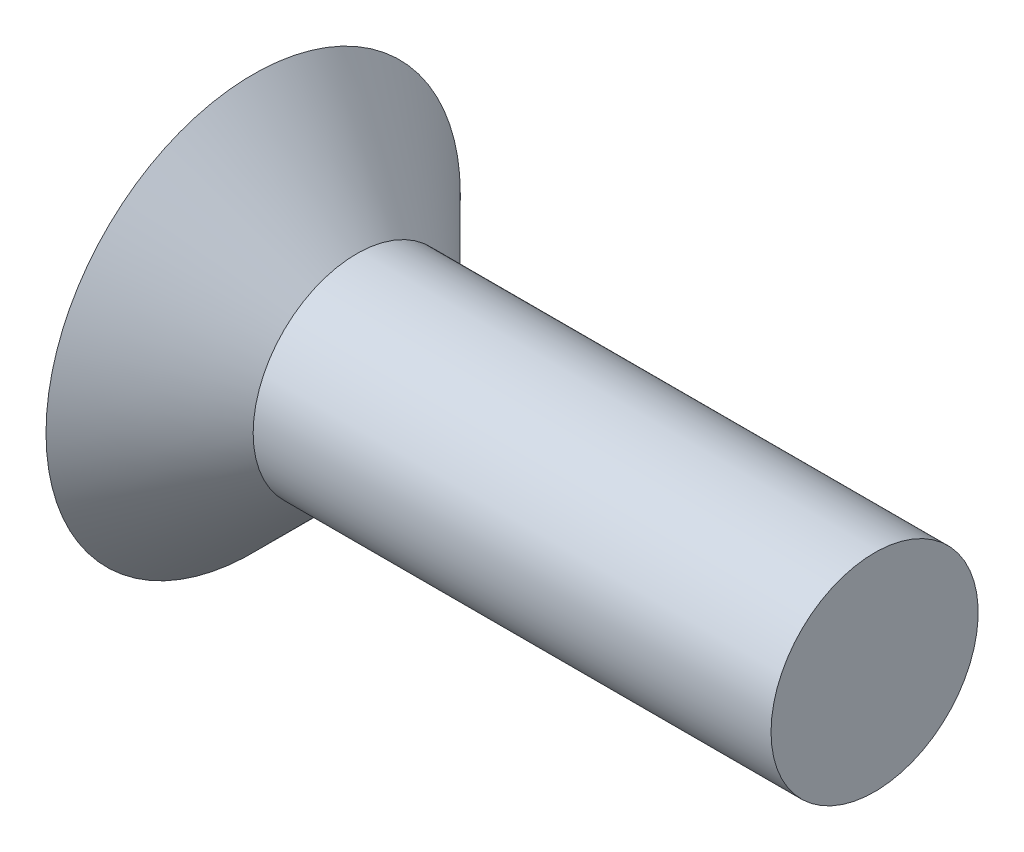
ISO-10303-21;
HEADER;
FILE_DESCRIPTION(('STEP AP214'),'2;1');
FILE_NAME('part.step','',(''),(''),'','','');
FILE_SCHEMA(('AUTOMOTIVE_DESIGN { 1 0 10303 214 1 1 1 1 }'));
ENDSEC;
DATA;
#1=APPLICATION_CONTEXT('core data for automotive mechanical design processes');
#2=APPLICATION_PROTOCOL_DEFINITION('international standard','automotive_design',2000,#1);
#3=PRODUCT_CONTEXT('',#1,'mechanical');
#4=PRODUCT('Part','Part','',(#3));
#5=PRODUCT_RELATED_PRODUCT_CATEGORY('part','',(#4));
#6=PRODUCT_DEFINITION_FORMATION('','',#4);
#7=PRODUCT_DEFINITION_CONTEXT('part definition',#1,'design');
#8=PRODUCT_DEFINITION('design','',#6,#7);
#9=PRODUCT_DEFINITION_SHAPE('','',#8);
#10=(LENGTH_UNIT() NAMED_UNIT(*) SI_UNIT(.MILLI.,.METRE.));
#11=(NAMED_UNIT(*) PLANE_ANGLE_UNIT() SI_UNIT($,.RADIAN.));
#12=(NAMED_UNIT(*) SI_UNIT($,.STERADIAN.) SOLID_ANGLE_UNIT());
#13=UNCERTAINTY_MEASURE_WITH_UNIT(LENGTH_MEASURE(1.E-05),#10,'distance_accuracy_value','');
#14=(GEOMETRIC_REPRESENTATION_CONTEXT(3) GLOBAL_UNCERTAINTY_ASSIGNED_CONTEXT((#13)) GLOBAL_UNIT_ASSIGNED_CONTEXT((#10,
#11,#12)) REPRESENTATION_CONTEXT('',''));
#15=CARTESIAN_POINT('',(0.,0.,0.));
#16=DIRECTION('',(0.,0.,1.));
#17=DIRECTION('',(1.,0.,0.));
#18=AXIS2_PLACEMENT_3D('',#15,#16,#17);
#19=CARTESIAN_POINT('',(-15.3050929133227,0.,-3.));
#20=DIRECTION('',(1.,0.,0.));
#21=DIRECTION('',(0.,0.,-1.));
#22=AXIS2_PLACEMENT_3D('',#19,#20,#21);
#23=PLANE('',#22);
#24=CARTESIAN_POINT('',(-15.3050929133227,0.,0.));
#25=DIRECTION('',(-1.,0.,0.));
#26=DIRECTION('',(0.,0.,1.));
#27=AXIS2_PLACEMENT_3D('',#24,#25,#26);
#28=CIRCLE('',#27,3.);
#29=CARTESIAN_POINT('',(-15.3050929133227,0.,3.));
#30=VERTEX_POINT('',#29);
#31=EDGE_CURVE('E43',#30,#30,#28,.T.);
#32=ORIENTED_EDGE('',*,*,#31,.T.);
#33=EDGE_LOOP('',(#32));
#34=FACE_BOUND('',#33,.T.);
#35=ADVANCED_FACE('F33',(#34),#23,.F.);
#36=CARTESIAN_POINT('',(-6.30509291332271,0.,0.));
#37=DIRECTION('',(-1.,0.,0.));
#38=DIRECTION('',(0.,0.,1.));
#39=AXIS2_PLACEMENT_3D('',#36,#37,#38);
#40=PLANE('',#39);
#41=CARTESIAN_POINT('',(-6.30509291332271,0.,0.));
#42=DIRECTION('',(-1.,0.,0.));
#43=DIRECTION('',(0.,0.,1.));
#44=AXIS2_PLACEMENT_3D('',#41,#42,#43);
#45=CIRCLE('',#44,1.50000000000011);
#46=CARTESIAN_POINT('',(-6.30509291332271,0.,1.50000000000011));
#47=VERTEX_POINT('',#46);
#48=EDGE_CURVE('E10',#47,#47,#45,.T.);
#49=ORIENTED_EDGE('',*,*,#48,.F.);
#50=EDGE_LOOP('',(#49));
#51=FACE_BOUND('',#50,.T.);
#52=ADVANCED_FACE('F58',(#51),#40,.F.);
#53=CARTESIAN_POINT('',(-15.3050929133227,0.,0.));
#54=DIRECTION('',(-1.,0.,0.));
#55=DIRECTION('',(0.,0.,1.));
#56=AXIS2_PLACEMENT_3D('',#53,#54,#55);
#57=CYLINDRICAL_SURFACE('',#56,1.50000000000006);
#58=CARTESIAN_POINT('',(-13.8050929133227,0.,0.));
#59=DIRECTION('',(-1.,0.,0.));
#60=DIRECTION('',(0.,0.,1.));
#61=AXIS2_PLACEMENT_3D('',#58,#59,#60);
#62=CIRCLE('',#61,1.50000000000001);
#63=CARTESIAN_POINT('',(-13.8050929133227,0.,1.50000000000001));
#64=VERTEX_POINT('',#63);
#65=EDGE_CURVE('E39',#64,#64,#62,.T.);
#66=ORIENTED_EDGE('',*,*,#65,.F.);
#67=EDGE_LOOP('',(#66));
#68=FACE_BOUND('',#67,.T.);
#69=ORIENTED_EDGE('',*,*,#48,.T.);
#70=EDGE_LOOP('',(#69));
#71=FACE_BOUND('',#70,.T.);
#72=ADVANCED_FACE('F53',(#68,#71),#57,.T.);
#73=CARTESIAN_POINT('',(-13.8050929133227,0.,0.));
#74=DIRECTION('',(-1.,0.,0.));
#75=DIRECTION('',(0.,0.,1.));
#76=AXIS2_PLACEMENT_3D('',#73,#74,#75);
#77=CONICAL_SURFACE('',#76,1.50000000000001,0.785398163397438);
#78=ORIENTED_EDGE('',*,*,#31,.F.);
#79=EDGE_LOOP('',(#78));
#80=FACE_BOUND('',#79,.T.);
#81=ORIENTED_EDGE('',*,*,#65,.T.);
#82=EDGE_LOOP('',(#81));
#83=FACE_BOUND('',#82,.T.);
#84=ADVANCED_FACE('F51',(#80,#83),#77,.T.);
#85=CLOSED_SHELL('',(#35,#52,#72,#84));
#86=MANIFOLD_SOLID_BREP('B2',#85);
#87=ADVANCED_BREP_SHAPE_REPRESENTATION('',(#18,#86),#14);
#88=SHAPE_DEFINITION_REPRESENTATION(#9,#87);
ENDSEC;
END-ISO-10303-21;
